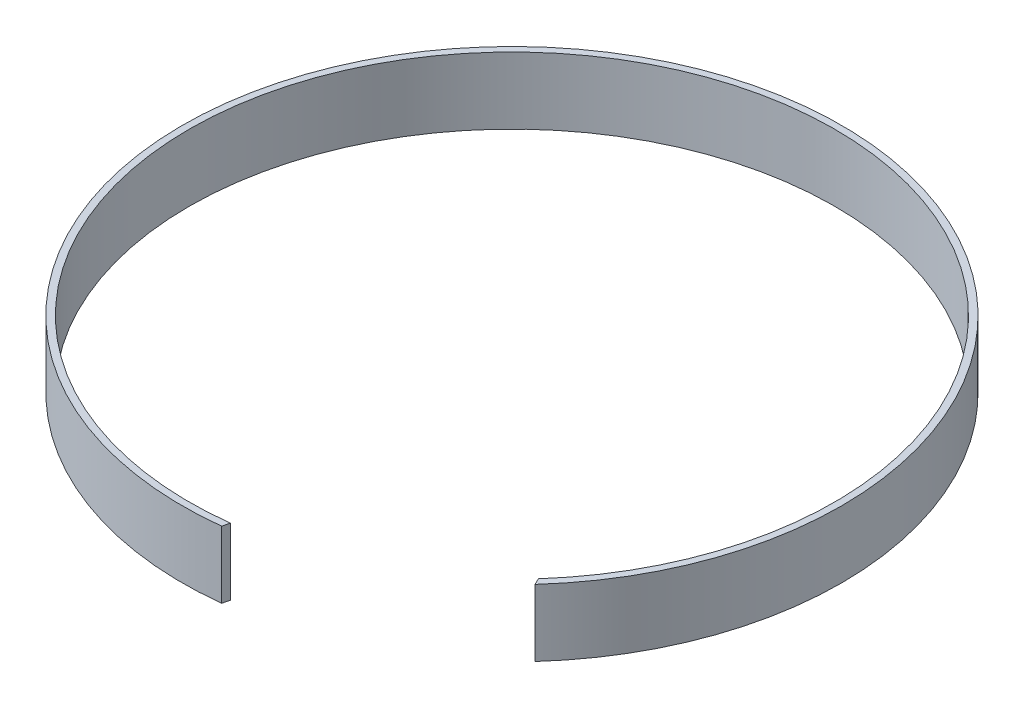
ISO-10303-21;
HEADER;
FILE_DESCRIPTION(('STEP AP214'),'2;1');
FILE_NAME('part.step','',(''),(''),'','','');
FILE_SCHEMA(('AUTOMOTIVE_DESIGN { 1 0 10303 214 1 1 1 1 }'));
ENDSEC;
DATA;
#1=APPLICATION_CONTEXT('core data for automotive mechanical design processes');
#2=APPLICATION_PROTOCOL_DEFINITION('international standard','automotive_design',2000,#1);
#3=PRODUCT_CONTEXT('',#1,'mechanical');
#4=PRODUCT('Part','Part','',(#3));
#5=PRODUCT_RELATED_PRODUCT_CATEGORY('part','',(#4));
#6=PRODUCT_DEFINITION_FORMATION('','',#4);
#7=PRODUCT_DEFINITION_CONTEXT('part definition',#1,'design');
#8=PRODUCT_DEFINITION('design','',#6,#7);
#9=PRODUCT_DEFINITION_SHAPE('','',#8);
#10=(LENGTH_UNIT() NAMED_UNIT(*) SI_UNIT(.MILLI.,.METRE.));
#11=(NAMED_UNIT(*) PLANE_ANGLE_UNIT() SI_UNIT($,.RADIAN.));
#12=(NAMED_UNIT(*) SI_UNIT($,.STERADIAN.) SOLID_ANGLE_UNIT());
#13=UNCERTAINTY_MEASURE_WITH_UNIT(LENGTH_MEASURE(1.E-05),#10,'distance_accuracy_value','');
#14=(GEOMETRIC_REPRESENTATION_CONTEXT(3) GLOBAL_UNCERTAINTY_ASSIGNED_CONTEXT((#13)) GLOBAL_UNIT_ASSIGNED_CONTEXT((#10,
#11,#12)) REPRESENTATION_CONTEXT('',''));
#15=CARTESIAN_POINT('',(0.,0.,0.));
#16=DIRECTION('',(0.,0.,1.));
#17=DIRECTION('',(1.,0.,0.));
#18=AXIS2_PLACEMENT_3D('',#15,#16,#17);
#19=CARTESIAN_POINT('',(0.,30.,0.));
#20=DIRECTION('',(0.,-1.,0.));
#21=DIRECTION('',(0.,0.,-1.));
#22=AXIS2_PLACEMENT_3D('',#19,#20,#21);
#23=CYLINDRICAL_SURFACE('',#22,148.032951282217);
#24=CARTESIAN_POINT('',(0.,0.,0.));
#25=DIRECTION('',(0.,1.,0.));
#26=DIRECTION('',(0.,0.,1.));
#27=AXIS2_PLACEMENT_3D('',#24,#25,#26);
#28=CIRCLE('',#27,148.032951282217);
#29=CARTESIAN_POINT('',(109.70959104,0.,99.385916));
#30=VERTEX_POINT('',#29);
#31=CARTESIAN_POINT('',(16.7383264722628,0.,147.083592192437));
#32=VERTEX_POINT('',#31);
#33=EDGE_CURVE('E105',#30,#32,#28,.T.);
#34=ORIENTED_EDGE('',*,*,#33,.T.);
#35=DIRECTION('',(0.,-1.,0.));
#36=VECTOR('',#35,1.);
#37=CARTESIAN_POINT('',(16.7383264722628,30.,147.083592192437));
#38=LINE('',#37,#36);
#39=CARTESIAN_POINT('',(16.7383264722628,30.,147.083592192437));
#40=VERTEX_POINT('',#39);
#41=EDGE_CURVE('E11',#40,#32,#38,.T.);
#42=ORIENTED_EDGE('',*,*,#41,.F.);
#43=CARTESIAN_POINT('',(0.,30.,0.));
#44=DIRECTION('',(0.,1.,0.));
#45=DIRECTION('',(0.,0.,1.));
#46=AXIS2_PLACEMENT_3D('',#43,#44,#45);
#47=CIRCLE('',#46,148.032951282217);
#48=CARTESIAN_POINT('',(109.70959104,30.,99.385916));
#49=VERTEX_POINT('',#48);
#50=EDGE_CURVE('E89',#49,#40,#47,.T.);
#51=ORIENTED_EDGE('',*,*,#50,.F.);
#52=DIRECTION('',(0.,-1.,0.));
#53=VECTOR('',#52,1.);
#54=CARTESIAN_POINT('',(109.70959104,30.,99.385916));
#55=LINE('',#54,#53);
#56=EDGE_CURVE('E97',#49,#30,#55,.T.);
#57=ORIENTED_EDGE('',*,*,#56,.T.);
#58=EDGE_LOOP('',(#34,#42,#51,#57));
#59=FACE_BOUND('',#58,.T.);
#60=ADVANCED_FACE('F39',(#59),#23,.T.);
#61=CARTESIAN_POINT('',(17.4688350009074,30.,143.943877270661));
#62=DIRECTION('',(-0.97398459656697,0.,-0.226614222082987));
#63=DIRECTION('',(-0.226614222082987,0.,0.97398459656697));
#64=AXIS2_PLACEMENT_3D('',#61,#62,#63);
#65=PLANE('',#64);
#66=DIRECTION('',(0.226614222082987,0.,-0.97398459656697));
#67=VECTOR('',#66,1.);
#68=CARTESIAN_POINT('',(17.4688350009074,0.,143.943877270661));
#69=LINE('',#68,#67);
#70=CARTESIAN_POINT('',(17.4688350009073,0.,143.943877270661));
#71=VERTEX_POINT('',#70);
#72=EDGE_CURVE('E92',#32,#71,#69,.T.);
#73=ORIENTED_EDGE('',*,*,#72,.T.);
#74=DIRECTION('',(0.,-1.,0.));
#75=VECTOR('',#74,1.);
#76=CARTESIAN_POINT('',(17.4688350009073,30.,143.943877270661));
#77=LINE('',#76,#75);
#78=CARTESIAN_POINT('',(17.4688350009073,30.,143.943877270661));
#79=VERTEX_POINT('',#78);
#80=EDGE_CURVE('E50',#79,#71,#77,.T.);
#81=ORIENTED_EDGE('',*,*,#80,.F.);
#82=DIRECTION('',(0.226614222082987,0.,-0.97398459656697));
#83=VECTOR('',#82,1.);
#84=CARTESIAN_POINT('',(17.4688350009074,30.,143.943877270661));
#85=LINE('',#84,#83);
#86=EDGE_CURVE('E82',#40,#79,#85,.T.);
#87=ORIENTED_EDGE('',*,*,#86,.F.);
#88=ORIENTED_EDGE('',*,*,#41,.T.);
#89=EDGE_LOOP('',(#73,#81,#87,#88));
#90=FACE_BOUND('',#89,.T.);
#91=ADVANCED_FACE('F93',(#90),#65,.F.);
#92=CARTESIAN_POINT('',(0.,30.,0.));
#93=DIRECTION('',(0.,-1.,0.));
#94=DIRECTION('',(0.,0.,-1.));
#95=AXIS2_PLACEMENT_3D('',#92,#93,#94);
#96=CYLINDRICAL_SURFACE('',#95,145.);
#97=CARTESIAN_POINT('',(0.,0.,0.));
#98=DIRECTION('',(0.,-1.,0.));
#99=DIRECTION('',(0.,0.,1.));
#100=AXIS2_PLACEMENT_3D('',#97,#98,#99);
#101=CIRCLE('',#100,145.);
#102=CARTESIAN_POINT('',(108.311394553209,0.,96.403536293743));
#103=VERTEX_POINT('',#102);
#104=EDGE_CURVE('E72',#71,#103,#101,.T.);
#105=ORIENTED_EDGE('',*,*,#104,.T.);
#106=DIRECTION('',(0.,-1.,0.));
#107=VECTOR('',#106,1.);
#108=CARTESIAN_POINT('',(108.311394553209,30.,96.403536293743));
#109=LINE('',#108,#107);
#110=CARTESIAN_POINT('',(108.311394553209,30.,96.403536293743));
#111=VERTEX_POINT('',#110);
#112=EDGE_CURVE('E94',#111,#103,#109,.T.);
#113=ORIENTED_EDGE('',*,*,#112,.F.);
#114=CARTESIAN_POINT('',(0.,30.,0.));
#115=DIRECTION('',(0.,-1.,0.));
#116=DIRECTION('',(0.,0.,1.));
#117=AXIS2_PLACEMENT_3D('',#114,#115,#116);
#118=CIRCLE('',#117,145.);
#119=EDGE_CURVE('E88',#79,#111,#118,.T.);
#120=ORIENTED_EDGE('',*,*,#119,.F.);
#121=ORIENTED_EDGE('',*,*,#80,.T.);
#122=EDGE_LOOP('',(#105,#113,#120,#121));
#123=FACE_BOUND('',#122,.T.);
#124=ADVANCED_FACE('F96',(#123),#96,.F.);
#125=CARTESIAN_POINT('',(109.70959104,30.,99.385916));
#126=DIRECTION('',(0.905434899778423,0.,-0.42448514963805));
#127=DIRECTION('',(-0.42448514963805,0.,-0.905434899778423));
#128=AXIS2_PLACEMENT_3D('',#125,#126,#127);
#129=PLANE('',#128);
#130=DIRECTION('',(0.42448514963805,0.,0.905434899778423));
#131=VECTOR('',#130,1.);
#132=CARTESIAN_POINT('',(109.70959104,0.,99.385916));
#133=LINE('',#132,#131);
#134=EDGE_CURVE('E76',#103,#30,#133,.T.);
#135=ORIENTED_EDGE('',*,*,#134,.T.);
#136=ORIENTED_EDGE('',*,*,#56,.F.);
#137=DIRECTION('',(0.42448514963805,0.,0.905434899778423));
#138=VECTOR('',#137,1.);
#139=CARTESIAN_POINT('',(109.70959104,30.,99.385916));
#140=LINE('',#139,#138);
#141=EDGE_CURVE('E54',#111,#49,#140,.T.);
#142=ORIENTED_EDGE('',*,*,#141,.F.);
#143=ORIENTED_EDGE('',*,*,#112,.T.);
#144=EDGE_LOOP('',(#135,#136,#142,#143));
#145=FACE_BOUND('',#144,.T.);
#146=ADVANCED_FACE('F108',(#145),#129,.F.);
#147=CARTESIAN_POINT('',(0.,30.,0.));
#148=DIRECTION('',(0.,1.,0.));
#149=DIRECTION('',(0.,0.,1.));
#150=AXIS2_PLACEMENT_3D('',#147,#148,#149);
#151=PLANE('',#150);
#152=ORIENTED_EDGE('',*,*,#50,.T.);
#153=ORIENTED_EDGE('',*,*,#86,.T.);
#154=ORIENTED_EDGE('',*,*,#119,.T.);
#155=ORIENTED_EDGE('',*,*,#141,.T.);
#156=EDGE_LOOP('',(#152,#153,#154,#155));
#157=FACE_BOUND('',#156,.T.);
#158=ADVANCED_FACE('F86',(#157),#151,.T.);
#159=CARTESIAN_POINT('',(0.,0.,0.));
#160=DIRECTION('',(0.,1.,0.));
#161=DIRECTION('',(0.,0.,1.));
#162=AXIS2_PLACEMENT_3D('',#159,#160,#161);
#163=PLANE('',#162);
#164=ORIENTED_EDGE('',*,*,#33,.F.);
#165=ORIENTED_EDGE('',*,*,#134,.F.);
#166=ORIENTED_EDGE('',*,*,#104,.F.);
#167=ORIENTED_EDGE('',*,*,#72,.F.);
#168=EDGE_LOOP('',(#164,#165,#166,#167));
#169=FACE_BOUND('',#168,.T.);
#170=ADVANCED_FACE('F115',(#169),#163,.F.);
#171=CLOSED_SHELL('',(#60,#91,#124,#146,#158,#170));
#172=MANIFOLD_SOLID_BREP('B2',#171);
#173=ADVANCED_BREP_SHAPE_REPRESENTATION('',(#18,#172),#14);
#174=SHAPE_DEFINITION_REPRESENTATION(#9,#173);
ENDSEC;
END-ISO-10303-21;
